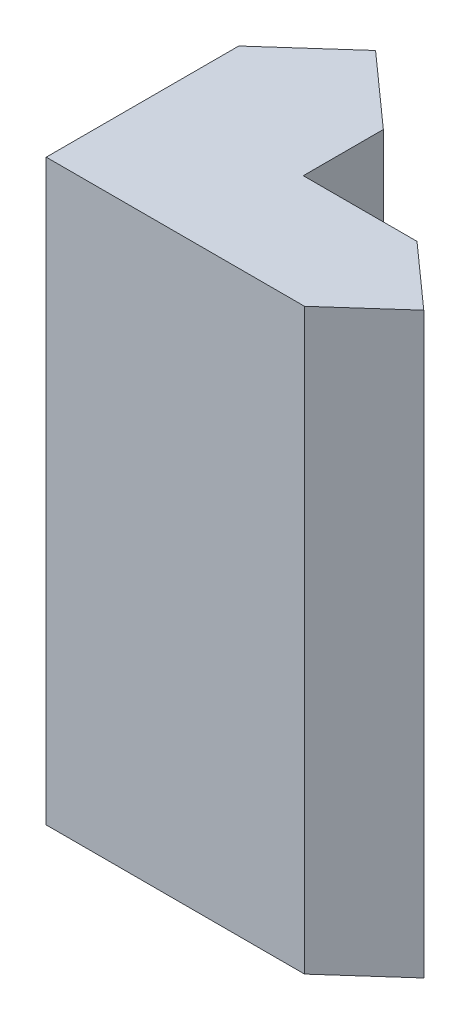
ISO-10303-21;
HEADER;
FILE_DESCRIPTION(('STEP AP214'),'2;1');
FILE_NAME('part.step','',(''),(''),'','','');
FILE_SCHEMA(('AUTOMOTIVE_DESIGN { 1 0 10303 214 1 1 1 1 }'));
ENDSEC;
DATA;
#1=APPLICATION_CONTEXT('core data for automotive mechanical design processes');
#2=APPLICATION_PROTOCOL_DEFINITION('international standard','automotive_design',2000,#1);
#3=PRODUCT_CONTEXT('',#1,'mechanical');
#4=PRODUCT('Part','Part','',(#3));
#5=PRODUCT_RELATED_PRODUCT_CATEGORY('part','',(#4));
#6=PRODUCT_DEFINITION_FORMATION('','',#4);
#7=PRODUCT_DEFINITION_CONTEXT('part definition',#1,'design');
#8=PRODUCT_DEFINITION('design','',#6,#7);
#9=PRODUCT_DEFINITION_SHAPE('','',#8);
#10=(LENGTH_UNIT() NAMED_UNIT(*) SI_UNIT(.MILLI.,.METRE.));
#11=(NAMED_UNIT(*) PLANE_ANGLE_UNIT() SI_UNIT($,.RADIAN.));
#12=(NAMED_UNIT(*) SI_UNIT($,.STERADIAN.) SOLID_ANGLE_UNIT());
#13=UNCERTAINTY_MEASURE_WITH_UNIT(LENGTH_MEASURE(1.E-05),#10,'distance_accuracy_value','');
#14=(GEOMETRIC_REPRESENTATION_CONTEXT(3) GLOBAL_UNCERTAINTY_ASSIGNED_CONTEXT((#13)) GLOBAL_UNIT_ASSIGNED_CONTEXT((#10,
#11,#12)) REPRESENTATION_CONTEXT('',''));
#15=CARTESIAN_POINT('',(0.,0.,0.));
#16=DIRECTION('',(0.,0.,1.));
#17=DIRECTION('',(1.,0.,0.));
#18=AXIS2_PLACEMENT_3D('',#15,#16,#17);
#19=CARTESIAN_POINT('',(-18.4063256176935,180.,-59.9194397838303));
#20=DIRECTION('',(1.,0.,0.));
#21=DIRECTION('',(0.,0.,-1.));
#22=AXIS2_PLACEMENT_3D('',#19,#20,#21);
#23=PLANE('',#22);
#24=DIRECTION('',(0.,0.,1.));
#25=VECTOR('',#24,1.);
#26=CARTESIAN_POINT('',(-18.4063256176935,90.,-59.9194397838303));
#27=LINE('',#26,#25);
#28=CARTESIAN_POINT('',(-18.4063256176935,90.,-59.9194397838303));
#29=VERTEX_POINT('',#28);
#30=CARTESIAN_POINT('',(-18.4063256176935,90.,-35.));
#31=VERTEX_POINT('',#30);
#32=EDGE_CURVE('E134',#29,#31,#27,.T.);
#33=ORIENTED_EDGE('',*,*,#32,.T.);
#34=DIRECTION('',(0.,-1.,0.));
#35=VECTOR('',#34,1.);
#36=CARTESIAN_POINT('',(-18.4063256176935,180.,-35.));
#37=LINE('',#36,#35);
#38=CARTESIAN_POINT('',(-18.4063256176935,0.,-35.));
#39=VERTEX_POINT('',#38);
#40=EDGE_CURVE('E161',#31,#39,#37,.T.);
#41=ORIENTED_EDGE('',*,*,#40,.T.);
#42=DIRECTION('',(0.,0.,1.));
#43=VECTOR('',#42,1.);
#44=CARTESIAN_POINT('',(-18.4063256176935,0.,-59.9194397838303));
#45=LINE('',#44,#43);
#46=CARTESIAN_POINT('',(-18.4063256176935,0.,0.));
#47=VERTEX_POINT('',#46);
#48=EDGE_CURVE('E131',#39,#47,#45,.T.);
#49=ORIENTED_EDGE('',*,*,#48,.T.);
#50=DIRECTION('',(0.,-1.,0.));
#51=VECTOR('',#50,1.);
#52=CARTESIAN_POINT('',(-18.4063256176935,180.,0.));
#53=LINE('',#52,#51);
#54=CARTESIAN_POINT('',(-18.4063256176935,180.,0.));
#55=VERTEX_POINT('',#54);
#56=EDGE_CURVE('E43',#55,#47,#53,.T.);
#57=ORIENTED_EDGE('',*,*,#56,.F.);
#58=DIRECTION('',(0.,0.,1.));
#59=VECTOR('',#58,1.);
#60=CARTESIAN_POINT('',(-18.4063256176935,180.,-59.9194397838303));
#61=LINE('',#60,#59);
#62=CARTESIAN_POINT('',(-18.4063256176935,180.,-59.9194397838303));
#63=VERTEX_POINT('',#62);
#64=EDGE_CURVE('E141',#63,#55,#61,.T.);
#65=ORIENTED_EDGE('',*,*,#64,.F.);
#66=DIRECTION('',(0.,-1.,0.));
#67=VECTOR('',#66,1.);
#68=CARTESIAN_POINT('',(-18.4063256176935,180.,-59.9194397838303));
#69=LINE('',#68,#67);
#70=EDGE_CURVE('E127',#63,#29,#69,.T.);
#71=ORIENTED_EDGE('',*,*,#70,.T.);
#72=EDGE_LOOP('',(#33,#41,#49,#57,#65,#71));
#73=FACE_BOUND('',#72,.T.);
#74=ADVANCED_FACE('F35',(#73),#23,.F.);
#75=CARTESIAN_POINT('',(-18.4063256176935,180.,0.));
#76=DIRECTION('',(0.,0.,-1.));
#77=DIRECTION('',(-1.,0.,0.));
#78=AXIS2_PLACEMENT_3D('',#75,#76,#77);
#79=PLANE('',#78);
#80=DIRECTION('',(1.,0.,0.));
#81=VECTOR('',#80,1.);
#82=CARTESIAN_POINT('',(-18.4063256176935,0.,0.));
#83=LINE('',#82,#81);
#84=CARTESIAN_POINT('',(61.9851576994434,0.,0.));
#85=VERTEX_POINT('',#84);
#86=EDGE_CURVE('E133',#47,#85,#83,.T.);
#87=ORIENTED_EDGE('',*,*,#86,.T.);
#88=DIRECTION('',(0.,-1.,0.));
#89=VECTOR('',#88,1.);
#90=CARTESIAN_POINT('',(61.9851576994434,180.,0.));
#91=LINE('',#90,#89);
#92=CARTESIAN_POINT('',(61.9851576994434,180.,0.));
#93=VERTEX_POINT('',#92);
#94=EDGE_CURVE('E150',#93,#85,#91,.T.);
#95=ORIENTED_EDGE('',*,*,#94,.F.);
#96=DIRECTION('',(1.,0.,0.));
#97=VECTOR('',#96,1.);
#98=CARTESIAN_POINT('',(-18.4063256176935,180.,0.));
#99=LINE('',#98,#97);
#100=EDGE_CURVE('E85',#55,#93,#99,.T.);
#101=ORIENTED_EDGE('',*,*,#100,.F.);
#102=ORIENTED_EDGE('',*,*,#56,.T.);
#103=EDGE_LOOP('',(#87,#95,#101,#102));
#104=FACE_BOUND('',#103,.T.);
#105=ADVANCED_FACE('F152',(#104),#79,.F.);
#106=CARTESIAN_POINT('',(61.9851576994434,180.,0.));
#107=DIRECTION('',(-0.665854763766186,0.,-0.746081385352749));
#108=DIRECTION('',(-0.746081385352749,0.,0.665854763766186));
#109=AXIS2_PLACEMENT_3D('',#106,#107,#108);
#110=PLANE('',#109);
#111=DIRECTION('',(0.746081385352749,0.,-0.665854763766186));
#112=VECTOR('',#111,1.);
#113=CARTESIAN_POINT('',(61.9851576994434,0.,0.));
#114=LINE('',#113,#112);
#115=CARTESIAN_POINT('',(81.5936743823065,0.,-17.5));
#116=VERTEX_POINT('',#115);
#117=EDGE_CURVE('E69',#85,#116,#114,.T.);
#118=ORIENTED_EDGE('',*,*,#117,.T.);
#119=DIRECTION('',(0.,-1.,0.));
#120=VECTOR('',#119,1.);
#121=CARTESIAN_POINT('',(81.5936743823065,180.,-17.5));
#122=LINE('',#121,#120);
#123=CARTESIAN_POINT('',(81.5936743823065,180.,-17.5));
#124=VERTEX_POINT('',#123);
#125=EDGE_CURVE('E148',#124,#116,#122,.T.);
#126=ORIENTED_EDGE('',*,*,#125,.F.);
#127=DIRECTION('',(0.746081385352749,0.,-0.665854763766186));
#128=VECTOR('',#127,1.);
#129=CARTESIAN_POINT('',(61.9851576994434,180.,0.));
#130=LINE('',#129,#128);
#131=EDGE_CURVE('E191',#93,#124,#130,.T.);
#132=ORIENTED_EDGE('',*,*,#131,.F.);
#133=ORIENTED_EDGE('',*,*,#94,.T.);
#134=EDGE_LOOP('',(#118,#126,#132,#133));
#135=FACE_BOUND('',#134,.T.);
#136=ADVANCED_FACE('F198',(#135),#110,.F.);
#137=CARTESIAN_POINT('',(81.5936743823065,180.,-17.5));
#138=DIRECTION('',(-0.665854763766186,0.,0.746081385352748));
#139=DIRECTION('',(0.746081385352748,0.,0.665854763766186));
#140=AXIS2_PLACEMENT_3D('',#137,#138,#139);
#141=PLANE('',#140);
#142=DIRECTION('',(-0.746081385352748,0.,-0.665854763766186));
#143=VECTOR('',#142,1.);
#144=CARTESIAN_POINT('',(81.5936743823065,0.,-17.5));
#145=LINE('',#144,#143);
#146=CARTESIAN_POINT('',(61.9851576994434,0.,-35.));
#147=VERTEX_POINT('',#146);
#148=EDGE_CURVE('E76',#116,#147,#145,.T.);
#149=ORIENTED_EDGE('',*,*,#148,.T.);
#150=DIRECTION('',(0.,-1.,0.));
#151=VECTOR('',#150,1.);
#152=CARTESIAN_POINT('',(61.9851576994434,180.,-35.));
#153=LINE('',#152,#151);
#154=CARTESIAN_POINT('',(61.9851576994434,180.,-35.));
#155=VERTEX_POINT('',#154);
#156=EDGE_CURVE('E146',#155,#147,#153,.T.);
#157=ORIENTED_EDGE('',*,*,#156,.F.);
#158=DIRECTION('',(-0.746081385352748,0.,-0.665854763766186));
#159=VECTOR('',#158,1.);
#160=CARTESIAN_POINT('',(81.5936743823065,180.,-17.5));
#161=LINE('',#160,#159);
#162=EDGE_CURVE('E193',#124,#155,#161,.T.);
#163=ORIENTED_EDGE('',*,*,#162,.F.);
#164=ORIENTED_EDGE('',*,*,#125,.T.);
#165=EDGE_LOOP('',(#149,#157,#163,#164));
#166=FACE_BOUND('',#165,.T.);
#167=ADVANCED_FACE('F196',(#166),#141,.F.);
#168=CARTESIAN_POINT('',(61.9851576994434,180.,-35.));
#169=DIRECTION('',(0.,0.,1.));
#170=DIRECTION('',(1.,0.,0.));
#171=AXIS2_PLACEMENT_3D('',#168,#169,#170);
#172=PLANE('',#171);
#173=DIRECTION('',(-1.,0.,0.));
#174=VECTOR('',#173,1.);
#175=CARTESIAN_POINT('',(61.9851576994434,0.,-35.));
#176=LINE('',#175,#174);
#177=EDGE_CURVE('E138',#147,#39,#176,.T.);
#178=ORIENTED_EDGE('',*,*,#177,.T.);
#179=ORIENTED_EDGE('',*,*,#40,.F.);
#180=DIRECTION('',(1.,0.,0.));
#181=VECTOR('',#180,1.);
#182=CARTESIAN_POINT('',(-173.406325617694,90.,-35.));
#183=LINE('',#182,#181);
#184=CARTESIAN_POINT('',(26.5936743823065,90.,-35.));
#185=VERTEX_POINT('',#184);
#186=EDGE_CURVE('E178',#31,#185,#183,.T.);
#187=ORIENTED_EDGE('',*,*,#186,.T.);
#188=DIRECTION('',(0.,-1.,0.));
#189=VECTOR('',#188,1.);
#190=CARTESIAN_POINT('',(26.5936743823065,180.,-35.));
#191=LINE('',#190,#189);
#192=CARTESIAN_POINT('',(26.5936743823065,180.,-35.));
#193=VERTEX_POINT('',#192);
#194=EDGE_CURVE('E121',#193,#185,#191,.T.);
#195=ORIENTED_EDGE('',*,*,#194,.F.);
#196=DIRECTION('',(-1.,0.,0.));
#197=VECTOR('',#196,1.);
#198=CARTESIAN_POINT('',(61.9851576994434,180.,-35.));
#199=LINE('',#198,#197);
#200=EDGE_CURVE('E107',#155,#193,#199,.T.);
#201=ORIENTED_EDGE('',*,*,#200,.F.);
#202=ORIENTED_EDGE('',*,*,#156,.T.);
#203=EDGE_LOOP('',(#178,#179,#187,#195,#201,#202));
#204=FACE_BOUND('',#203,.T.);
#205=ADVANCED_FACE('F166',(#204),#172,.F.);
#206=CARTESIAN_POINT('',(26.5936743823065,180.,-35.));
#207=DIRECTION('',(-1.,0.,0.));
#208=DIRECTION('',(0.,0.,1.));
#209=AXIS2_PLACEMENT_3D('',#206,#207,#208);
#210=PLANE('',#209);
#211=ORIENTED_EDGE('',*,*,#194,.T.);
#212=DIRECTION('',(0.,0.,1.));
#213=VECTOR('',#212,1.);
#214=CARTESIAN_POINT('',(26.5936743823065,90.,-35.));
#215=LINE('',#214,#213);
#216=CARTESIAN_POINT('',(26.5936743823065,90.,-59.9194397838303));
#217=VERTEX_POINT('',#216);
#218=EDGE_CURVE('E118',#217,#185,#215,.T.);
#219=ORIENTED_EDGE('',*,*,#218,.F.);
#220=DIRECTION('',(0.,-1.,0.));
#221=VECTOR('',#220,1.);
#222=CARTESIAN_POINT('',(26.5936743823065,180.,-59.9194397838303));
#223=LINE('',#222,#221);
#224=CARTESIAN_POINT('',(26.5936743823065,180.,-59.9194397838303));
#225=VERTEX_POINT('',#224);
#226=EDGE_CURVE('E114',#225,#217,#223,.T.);
#227=ORIENTED_EDGE('',*,*,#226,.F.);
#228=DIRECTION('',(0.,0.,-1.));
#229=VECTOR('',#228,1.);
#230=CARTESIAN_POINT('',(26.5936743823065,180.,-35.));
#231=LINE('',#230,#229);
#232=EDGE_CURVE('E100',#193,#225,#231,.T.);
#233=ORIENTED_EDGE('',*,*,#232,.F.);
#234=EDGE_LOOP('',(#211,#219,#227,#233));
#235=FACE_BOUND('',#234,.T.);
#236=ADVANCED_FACE('F115',(#235),#210,.F.);
#237=CARTESIAN_POINT('',(26.5936743823065,180.,-59.9194397838303));
#238=DIRECTION('',(-0.665854763766186,0.,0.746081385352748));
#239=DIRECTION('',(0.746081385352748,0.,0.665854763766186));
#240=AXIS2_PLACEMENT_3D('',#237,#238,#239);
#241=PLANE('',#240);
#242=ORIENTED_EDGE('',*,*,#226,.T.);
#243=DIRECTION('',(-0.746081385352748,0.,-0.665854763766186));
#244=VECTOR('',#243,1.);
#245=CARTESIAN_POINT('',(26.5936743823065,90.,-59.9194397838303));
#246=LINE('',#245,#244);
#247=CARTESIAN_POINT('',(4.09367438230645,90.,-80.));
#248=VERTEX_POINT('',#247);
#249=EDGE_CURVE('E183',#217,#248,#246,.T.);
#250=ORIENTED_EDGE('',*,*,#249,.T.);
#251=DIRECTION('',(0.,-1.,0.));
#252=VECTOR('',#251,1.);
#253=CARTESIAN_POINT('',(4.09367438230645,180.,-80.));
#254=LINE('',#253,#252);
#255=CARTESIAN_POINT('',(4.09367438230645,180.,-80.));
#256=VERTEX_POINT('',#255);
#257=EDGE_CURVE('E122',#256,#248,#254,.T.);
#258=ORIENTED_EDGE('',*,*,#257,.F.);
#259=DIRECTION('',(-0.746081385352748,0.,-0.665854763766186));
#260=VECTOR('',#259,1.);
#261=CARTESIAN_POINT('',(26.5936743823065,180.,-59.9194397838303));
#262=LINE('',#261,#260);
#263=EDGE_CURVE('E104',#225,#256,#262,.T.);
#264=ORIENTED_EDGE('',*,*,#263,.F.);
#265=EDGE_LOOP('',(#242,#250,#258,#264));
#266=FACE_BOUND('',#265,.T.);
#267=ADVANCED_FACE('F124',(#266),#241,.F.);
#268=CARTESIAN_POINT('',(4.09367438230645,180.,-80.));
#269=DIRECTION('',(0.665854763766187,0.,0.746081385352748));
#270=DIRECTION('',(0.746081385352748,0.,-0.665854763766187));
#271=AXIS2_PLACEMENT_3D('',#268,#269,#270);
#272=PLANE('',#271);
#273=ORIENTED_EDGE('',*,*,#257,.T.);
#274=DIRECTION('',(-0.746081385352748,0.,0.665854763766187));
#275=VECTOR('',#274,1.);
#276=CARTESIAN_POINT('',(4.09367438230645,90.,-80.));
#277=LINE('',#276,#275);
#278=EDGE_CURVE('E11',#248,#29,#277,.T.);
#279=ORIENTED_EDGE('',*,*,#278,.T.);
#280=ORIENTED_EDGE('',*,*,#70,.F.);
#281=DIRECTION('',(-0.746081385352748,0.,0.665854763766187));
#282=VECTOR('',#281,1.);
#283=CARTESIAN_POINT('',(4.09367438230645,180.,-80.));
#284=LINE('',#283,#282);
#285=EDGE_CURVE('E51',#256,#63,#284,.T.);
#286=ORIENTED_EDGE('',*,*,#285,.F.);
#287=EDGE_LOOP('',(#273,#279,#280,#286));
#288=FACE_BOUND('',#287,.T.);
#289=ADVANCED_FACE('F229',(#288),#272,.F.);
#290=CARTESIAN_POINT('',(0.,180.,0.));
#291=DIRECTION('',(0.,1.,0.));
#292=DIRECTION('',(0.,0.,1.));
#293=AXIS2_PLACEMENT_3D('',#290,#291,#292);
#294=PLANE('',#293);
#295=ORIENTED_EDGE('',*,*,#64,.T.);
#296=ORIENTED_EDGE('',*,*,#100,.T.);
#297=ORIENTED_EDGE('',*,*,#131,.T.);
#298=ORIENTED_EDGE('',*,*,#162,.T.);
#299=ORIENTED_EDGE('',*,*,#200,.T.);
#300=ORIENTED_EDGE('',*,*,#232,.T.);
#301=ORIENTED_EDGE('',*,*,#263,.T.);
#302=ORIENTED_EDGE('',*,*,#285,.T.);
#303=EDGE_LOOP('',(#295,#296,#297,#298,#299,#300,#301,#302));
#304=FACE_BOUND('',#303,.T.);
#305=ADVANCED_FACE('F102',(#304),#294,.T.);
#306=CARTESIAN_POINT('',(0.,0.,0.));
#307=DIRECTION('',(0.,1.,0.));
#308=DIRECTION('',(0.,0.,1.));
#309=AXIS2_PLACEMENT_3D('',#306,#307,#308);
#310=PLANE('',#309);
#311=ORIENTED_EDGE('',*,*,#48,.F.);
#312=ORIENTED_EDGE('',*,*,#177,.F.);
#313=ORIENTED_EDGE('',*,*,#148,.F.);
#314=ORIENTED_EDGE('',*,*,#117,.F.);
#315=ORIENTED_EDGE('',*,*,#86,.F.);
#316=EDGE_LOOP('',(#311,#312,#313,#314,#315));
#317=FACE_BOUND('',#316,.T.);
#318=ADVANCED_FACE('F164',(#317),#310,.F.);
#319=CARTESIAN_POINT('',(-173.406325617694,90.,-35.));
#320=DIRECTION('',(0.,1.,0.));
#321=DIRECTION('',(0.,0.,1.));
#322=AXIS2_PLACEMENT_3D('',#319,#320,#321);
#323=PLANE('',#322);
#324=ORIENTED_EDGE('',*,*,#278,.F.);
#325=ORIENTED_EDGE('',*,*,#249,.F.);
#326=ORIENTED_EDGE('',*,*,#218,.T.);
#327=ORIENTED_EDGE('',*,*,#186,.F.);
#328=ORIENTED_EDGE('',*,*,#32,.F.);
#329=EDGE_LOOP('',(#324,#325,#326,#327,#328));
#330=FACE_BOUND('',#329,.T.);
#331=ADVANCED_FACE('F182',(#330),#323,.F.);
#332=CLOSED_SHELL('',(#74,#105,#136,#167,#205,#236,#267,#289,#305,#318,#331));
#333=MANIFOLD_SOLID_BREP('B2',#332);
#334=ADVANCED_BREP_SHAPE_REPRESENTATION('',(#18,#333),#14);
#335=SHAPE_DEFINITION_REPRESENTATION(#9,#334);
ENDSEC;
END-ISO-10303-21;
